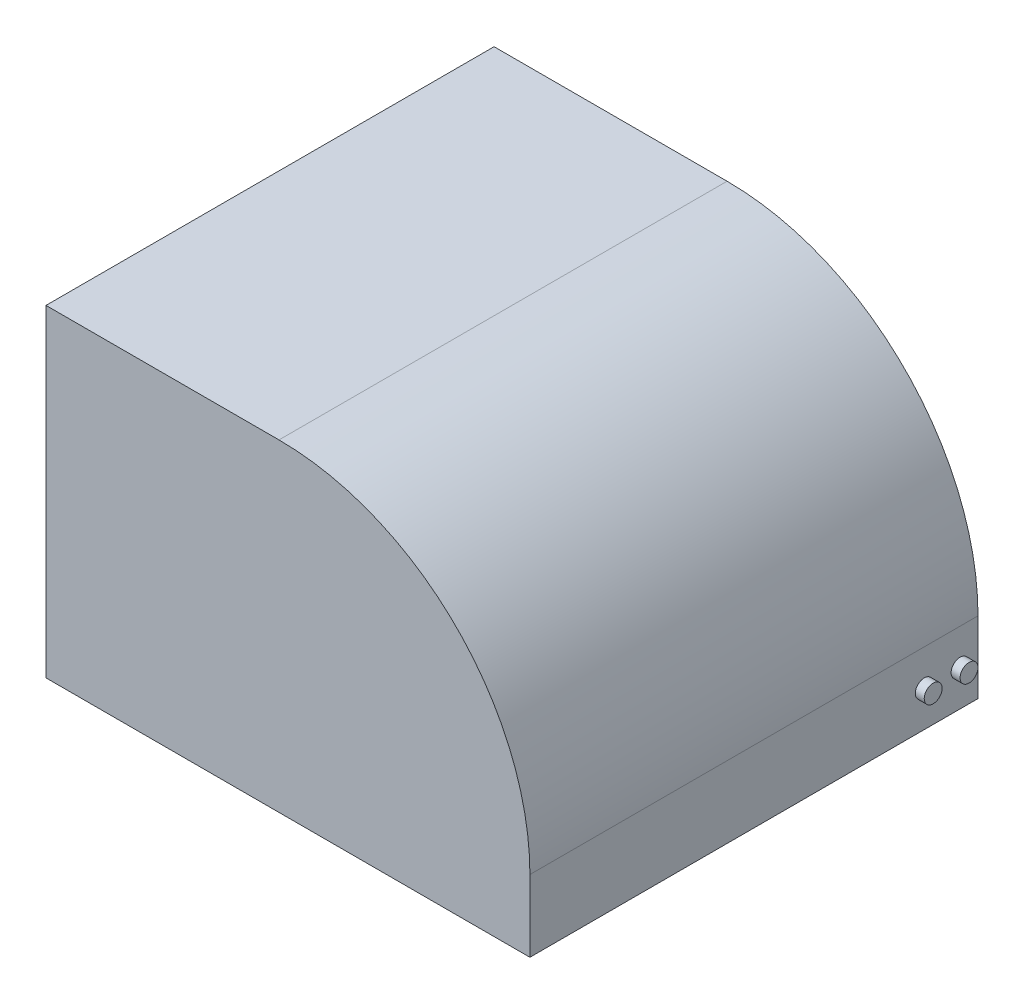
ISO-10303-21;
HEADER;
FILE_DESCRIPTION(('STEP AP214'),'2;1');
FILE_NAME('part.step','',(''),(''),'','','');
FILE_SCHEMA(('AUTOMOTIVE_DESIGN { 1 0 10303 214 1 1 1 1 }'));
ENDSEC;
DATA;
#1=APPLICATION_CONTEXT('core data for automotive mechanical design processes');
#2=APPLICATION_PROTOCOL_DEFINITION('international standard','automotive_design',2000,#1);
#3=PRODUCT_CONTEXT('',#1,'mechanical');
#4=PRODUCT('Part','Part','',(#3));
#5=PRODUCT_RELATED_PRODUCT_CATEGORY('part','',(#4));
#6=PRODUCT_DEFINITION_FORMATION('','',#4);
#7=PRODUCT_DEFINITION_CONTEXT('part definition',#1,'design');
#8=PRODUCT_DEFINITION('design','',#6,#7);
#9=PRODUCT_DEFINITION_SHAPE('','',#8);
#10=(LENGTH_UNIT() NAMED_UNIT(*) SI_UNIT(.MILLI.,.METRE.));
#11=(NAMED_UNIT(*) PLANE_ANGLE_UNIT() SI_UNIT($,.RADIAN.));
#12=(NAMED_UNIT(*) SI_UNIT($,.STERADIAN.) SOLID_ANGLE_UNIT());
#13=UNCERTAINTY_MEASURE_WITH_UNIT(LENGTH_MEASURE(1.E-05),#10,'distance_accuracy_value','');
#14=(GEOMETRIC_REPRESENTATION_CONTEXT(3) GLOBAL_UNCERTAINTY_ASSIGNED_CONTEXT((#13)) GLOBAL_UNIT_ASSIGNED_CONTEXT((#10,
#11,#12)) REPRESENTATION_CONTEXT('',''));
#15=CARTESIAN_POINT('',(0.,0.,0.));
#16=DIRECTION('',(0.,0.,1.));
#17=DIRECTION('',(1.,0.,0.));
#18=AXIS2_PLACEMENT_3D('',#15,#16,#17);
#19=CARTESIAN_POINT('',(-31.75,56.,0.));
#20=DIRECTION('',(0.,0.,1.));
#21=DIRECTION('',(1.,0.,0.));
#22=AXIS2_PLACEMENT_3D('',#19,#20,#21);
#23=CYLINDRICAL_SURFACE('',#22,14.);
#24=DIRECTION('',(0.,0.,-1.));
#25=VECTOR('',#24,1.);
#26=CARTESIAN_POINT('',(-31.75,70.,0.));
#27=LINE('',#26,#25);
#28=CARTESIAN_POINT('',(-31.75,70.,59.));
#29=VERTEX_POINT('',#28);
#30=CARTESIAN_POINT('',(-31.75,70.,34.));
#31=VERTEX_POINT('',#30);
#32=EDGE_CURVE('E106',#29,#31,#27,.T.);
#33=ORIENTED_EDGE('',*,*,#32,.F.);
#34=CARTESIAN_POINT('',(-31.75,56.,59.));
#35=DIRECTION('',(0.,0.,-1.));
#36=DIRECTION('',(-1.,0.,0.));
#37=AXIS2_PLACEMENT_3D('',#34,#35,#36);
#38=CIRCLE('',#37,14.);
#39=CARTESIAN_POINT('',(-17.75,56.,59.));
#40=VERTEX_POINT('',#39);
#41=EDGE_CURVE('E59',#40,#29,#38,.F.);
#42=ORIENTED_EDGE('',*,*,#41,.F.);
#43=DIRECTION('',(0.,0.,-1.));
#44=VECTOR('',#43,1.);
#45=CARTESIAN_POINT('',(-17.75,56.,0.));
#46=LINE('',#45,#44);
#47=CARTESIAN_POINT('',(-17.75,56.,34.));
#48=VERTEX_POINT('',#47);
#49=EDGE_CURVE('E108',#48,#40,#46,.F.);
#50=ORIENTED_EDGE('',*,*,#49,.F.);
#51=CARTESIAN_POINT('',(-31.75,56.,34.));
#52=DIRECTION('',(0.,0.,1.));
#53=DIRECTION('',(1.,0.,0.));
#54=AXIS2_PLACEMENT_3D('',#51,#52,#53);
#55=CIRCLE('',#54,14.);
#56=EDGE_CURVE('E52',#31,#48,#55,.F.);
#57=ORIENTED_EDGE('',*,*,#56,.F.);
#58=EDGE_LOOP('',(#33,#42,#50,#57));
#59=FACE_BOUND('',#58,.T.);
#60=ADVANCED_FACE('F38',(#59),#23,.T.);
#61=CARTESIAN_POINT('',(-17.75,106.796738985948,34.));
#62=DIRECTION('',(-1.,0.,0.));
#63=DIRECTION('',(0.,0.,1.));
#64=AXIS2_PLACEMENT_3D('',#61,#62,#63);
#65=PLANE('',#64);
#66=CARTESIAN_POINT('',(-17.75,54.,37.));
#67=DIRECTION('',(-1.,0.,0.));
#68=DIRECTION('',(0.,0.,1.));
#69=AXIS2_PLACEMENT_3D('',#66,#67,#68);
#70=CIRCLE('',#69,0.499999999999999);
#71=CARTESIAN_POINT('',(-17.75,54.,37.5));
#72=VERTEX_POINT('',#71);
#73=EDGE_CURVE('E11',#72,#72,#70,.F.);
#74=ORIENTED_EDGE('',*,*,#73,.F.);
#75=EDGE_LOOP('',(#74));
#76=FACE_BOUND('',#75,.T.);
#77=CARTESIAN_POINT('',(-17.75,54.,35.));
#78=DIRECTION('',(-1.,0.,0.));
#79=DIRECTION('',(0.,0.,1.));
#80=AXIS2_PLACEMENT_3D('',#77,#78,#79);
#81=CIRCLE('',#80,0.499999999999999);
#82=CARTESIAN_POINT('',(-17.75,54.,35.5));
#83=VERTEX_POINT('',#82);
#84=EDGE_CURVE('E45',#83,#83,#81,.F.);
#85=ORIENTED_EDGE('',*,*,#84,.F.);
#86=EDGE_LOOP('',(#85));
#87=FACE_BOUND('',#86,.T.);
#88=DIRECTION('',(0.,-1.,0.));
#89=VECTOR('',#88,1.);
#90=CARTESIAN_POINT('',(-17.75,106.796738985948,34.));
#91=LINE('',#90,#89);
#92=CARTESIAN_POINT('',(-17.75,52.,34.));
#93=VERTEX_POINT('',#92);
#94=EDGE_CURVE('E115',#48,#93,#91,.T.);
#95=ORIENTED_EDGE('',*,*,#94,.F.);
#96=ORIENTED_EDGE('',*,*,#49,.T.);
#97=DIRECTION('',(0.,-1.,0.));
#98=VECTOR('',#97,1.);
#99=CARTESIAN_POINT('',(-17.75,106.796738985948,59.));
#100=LINE('',#99,#98);
#101=CARTESIAN_POINT('',(-17.75,52.,59.));
#102=VERTEX_POINT('',#101);
#103=EDGE_CURVE('E120',#40,#102,#100,.T.);
#104=ORIENTED_EDGE('',*,*,#103,.T.);
#105=DIRECTION('',(0.,0.,-1.));
#106=VECTOR('',#105,1.);
#107=CARTESIAN_POINT('',(-17.75,52.,34.));
#108=LINE('',#107,#106);
#109=EDGE_CURVE('E112',#102,#93,#108,.T.);
#110=ORIENTED_EDGE('',*,*,#109,.T.);
#111=EDGE_LOOP('',(#95,#96,#104,#110));
#112=FACE_BOUND('',#111,.T.);
#113=ADVANCED_FACE('F130',(#76,#87,#112),#65,.F.);
#114=CARTESIAN_POINT('',(-17.75,106.796738985948,34.));
#115=DIRECTION('',(0.,0.,1.));
#116=DIRECTION('',(1.,0.,0.));
#117=AXIS2_PLACEMENT_3D('',#114,#115,#116);
#118=PLANE('',#117);
#119=DIRECTION('',(-1.,0.,0.));
#120=VECTOR('',#119,1.);
#121=CARTESIAN_POINT('',(-17.75,70.,34.));
#122=LINE('',#121,#120);
#123=CARTESIAN_POINT('',(-44.75,70.,34.));
#124=VERTEX_POINT('',#123);
#125=EDGE_CURVE('E103',#31,#124,#122,.T.);
#126=ORIENTED_EDGE('',*,*,#125,.F.);
#127=ORIENTED_EDGE('',*,*,#56,.T.);
#128=ORIENTED_EDGE('',*,*,#94,.T.);
#129=DIRECTION('',(-1.,0.,0.));
#130=VECTOR('',#129,1.);
#131=CARTESIAN_POINT('',(-17.75,52.,34.));
#132=LINE('',#131,#130);
#133=CARTESIAN_POINT('',(-44.75,52.,34.));
#134=VERTEX_POINT('',#133);
#135=EDGE_CURVE('E117',#93,#134,#132,.T.);
#136=ORIENTED_EDGE('',*,*,#135,.T.);
#137=DIRECTION('',(0.,-1.,0.));
#138=VECTOR('',#137,1.);
#139=CARTESIAN_POINT('',(-44.75,106.796738985948,34.));
#140=LINE('',#139,#138);
#141=EDGE_CURVE('E118',#124,#134,#140,.T.);
#142=ORIENTED_EDGE('',*,*,#141,.F.);
#143=EDGE_LOOP('',(#126,#127,#128,#136,#142));
#144=FACE_BOUND('',#143,.T.);
#145=ADVANCED_FACE('F133',(#144),#118,.F.);
#146=CARTESIAN_POINT('',(-44.75,106.796738985948,34.));
#147=DIRECTION('',(1.,0.,0.));
#148=DIRECTION('',(0.,0.,-1.));
#149=AXIS2_PLACEMENT_3D('',#146,#147,#148);
#150=PLANE('',#149);
#151=DIRECTION('',(0.,0.,1.));
#152=VECTOR('',#151,1.);
#153=CARTESIAN_POINT('',(-44.75,70.,34.));
#154=LINE('',#153,#152);
#155=CARTESIAN_POINT('',(-44.75,70.,59.));
#156=VERTEX_POINT('',#155);
#157=EDGE_CURVE('E88',#124,#156,#154,.T.);
#158=ORIENTED_EDGE('',*,*,#157,.F.);
#159=ORIENTED_EDGE('',*,*,#141,.T.);
#160=DIRECTION('',(0.,0.,1.));
#161=VECTOR('',#160,1.);
#162=CARTESIAN_POINT('',(-44.75,52.,34.));
#163=LINE('',#162,#161);
#164=CARTESIAN_POINT('',(-44.75,52.,59.));
#165=VERTEX_POINT('',#164);
#166=EDGE_CURVE('E91',#134,#165,#163,.T.);
#167=ORIENTED_EDGE('',*,*,#166,.T.);
#168=DIRECTION('',(0.,-1.,0.));
#169=VECTOR('',#168,1.);
#170=CARTESIAN_POINT('',(-44.75,106.796738985948,59.));
#171=LINE('',#170,#169);
#172=EDGE_CURVE('E84',#156,#165,#171,.T.);
#173=ORIENTED_EDGE('',*,*,#172,.F.);
#174=EDGE_LOOP('',(#158,#159,#167,#173));
#175=FACE_BOUND('',#174,.T.);
#176=ADVANCED_FACE('F86',(#175),#150,.F.);
#177=CARTESIAN_POINT('',(-17.75,106.796738985948,59.));
#178=DIRECTION('',(0.,0.,-1.));
#179=DIRECTION('',(-1.,0.,0.));
#180=AXIS2_PLACEMENT_3D('',#177,#178,#179);
#181=PLANE('',#180);
#182=ORIENTED_EDGE('',*,*,#103,.F.);
#183=ORIENTED_EDGE('',*,*,#41,.T.);
#184=DIRECTION('',(1.,0.,0.));
#185=VECTOR('',#184,1.);
#186=CARTESIAN_POINT('',(-17.75,70.,59.));
#187=LINE('',#186,#185);
#188=EDGE_CURVE('E98',#156,#29,#187,.T.);
#189=ORIENTED_EDGE('',*,*,#188,.F.);
#190=ORIENTED_EDGE('',*,*,#172,.T.);
#191=DIRECTION('',(1.,0.,0.));
#192=VECTOR('',#191,1.);
#193=CARTESIAN_POINT('',(-17.75,52.,59.));
#194=LINE('',#193,#192);
#195=EDGE_CURVE('E95',#165,#102,#194,.T.);
#196=ORIENTED_EDGE('',*,*,#195,.T.);
#197=EDGE_LOOP('',(#182,#183,#189,#190,#196));
#198=FACE_BOUND('',#197,.T.);
#199=ADVANCED_FACE('F100',(#198),#181,.F.);
#200=CARTESIAN_POINT('',(0.,52.,0.));
#201=DIRECTION('',(0.,-1.,0.));
#202=DIRECTION('',(0.,0.,-1.));
#203=AXIS2_PLACEMENT_3D('',#200,#201,#202);
#204=PLANE('',#203);
#205=ORIENTED_EDGE('',*,*,#109,.F.);
#206=ORIENTED_EDGE('',*,*,#195,.F.);
#207=ORIENTED_EDGE('',*,*,#166,.F.);
#208=ORIENTED_EDGE('',*,*,#135,.F.);
#209=EDGE_LOOP('',(#205,#206,#207,#208));
#210=FACE_BOUND('',#209,.T.);
#211=ADVANCED_FACE('F142',(#210),#204,.T.);
#212=CARTESIAN_POINT('',(0.,70.,0.));
#213=DIRECTION('',(0.,1.,0.));
#214=DIRECTION('',(0.,0.,1.));
#215=AXIS2_PLACEMENT_3D('',#212,#213,#214);
#216=PLANE('',#215);
#217=ORIENTED_EDGE('',*,*,#188,.T.);
#218=ORIENTED_EDGE('',*,*,#32,.T.);
#219=ORIENTED_EDGE('',*,*,#125,.T.);
#220=ORIENTED_EDGE('',*,*,#157,.T.);
#221=EDGE_LOOP('',(#217,#218,#219,#220));
#222=FACE_BOUND('',#221,.T.);
#223=ADVANCED_FACE('F105',(#222),#216,.T.);
#224=CARTESIAN_POINT('',(-17.25,54.,35.));
#225=DIRECTION('',(-1.,0.,0.));
#226=DIRECTION('',(0.,0.,1.));
#227=AXIS2_PLACEMENT_3D('',#224,#225,#226);
#228=CYLINDRICAL_SURFACE('',#227,0.499999999999999);
#229=CARTESIAN_POINT('',(-17.25,54.,35.));
#230=DIRECTION('',(1.,0.,0.));
#231=DIRECTION('',(0.,0.,-1.));
#232=AXIS2_PLACEMENT_3D('',#229,#230,#231);
#233=CIRCLE('',#232,0.499999999999999);
#234=CARTESIAN_POINT('',(-17.25,54.,34.5));
#235=VERTEX_POINT('',#234);
#236=EDGE_CURVE('E121',#235,#235,#233,.T.);
#237=ORIENTED_EDGE('',*,*,#236,.F.);
#238=EDGE_LOOP('',(#237));
#239=FACE_BOUND('',#238,.T.);
#240=ORIENTED_EDGE('',*,*,#84,.T.);
#241=EDGE_LOOP('',(#240));
#242=FACE_BOUND('',#241,.T.);
#243=ADVANCED_FACE('F128',(#239,#242),#228,.T.);
#244=CARTESIAN_POINT('',(-17.25,54.,35.));
#245=DIRECTION('',(1.,0.,0.));
#246=DIRECTION('',(0.,0.,-1.));
#247=AXIS2_PLACEMENT_3D('',#244,#245,#246);
#248=PLANE('',#247);
#249=ORIENTED_EDGE('',*,*,#236,.T.);
#250=EDGE_LOOP('',(#249));
#251=FACE_BOUND('',#250,.T.);
#252=ADVANCED_FACE('F157',(#251),#248,.T.);
#253=CARTESIAN_POINT('',(-17.25,54.,37.));
#254=DIRECTION('',(-1.,0.,0.));
#255=DIRECTION('',(0.,0.,1.));
#256=AXIS2_PLACEMENT_3D('',#253,#254,#255);
#257=CYLINDRICAL_SURFACE('',#256,0.499999999999999);
#258=CARTESIAN_POINT('',(-17.25,54.,37.));
#259=DIRECTION('',(1.,0.,0.));
#260=DIRECTION('',(0.,0.,-1.));
#261=AXIS2_PLACEMENT_3D('',#258,#259,#260);
#262=CIRCLE('',#261,0.499999999999999);
#263=CARTESIAN_POINT('',(-17.25,54.,36.5));
#264=VERTEX_POINT('',#263);
#265=EDGE_CURVE('E148',#264,#264,#262,.T.);
#266=ORIENTED_EDGE('',*,*,#265,.F.);
#267=EDGE_LOOP('',(#266));
#268=FACE_BOUND('',#267,.T.);
#269=ORIENTED_EDGE('',*,*,#73,.T.);
#270=EDGE_LOOP('',(#269));
#271=FACE_BOUND('',#270,.T.);
#272=ADVANCED_FACE('F154',(#268,#271),#257,.T.);
#273=CARTESIAN_POINT('',(-17.25,54.,37.));
#274=DIRECTION('',(1.,0.,0.));
#275=DIRECTION('',(0.,0.,-1.));
#276=AXIS2_PLACEMENT_3D('',#273,#274,#275);
#277=PLANE('',#276);
#278=ORIENTED_EDGE('',*,*,#265,.T.);
#279=EDGE_LOOP('',(#278));
#280=FACE_BOUND('',#279,.T.);
#281=ADVANCED_FACE('F152',(#280),#277,.T.);
#282=CLOSED_SHELL('',(#60,#113,#145,#176,#199,#211,#223,#243,#252,#272,#281));
#283=MANIFOLD_SOLID_BREP('B2',#282);
#284=ADVANCED_BREP_SHAPE_REPRESENTATION('',(#18,#283),#14);
#285=SHAPE_DEFINITION_REPRESENTATION(#9,#284);
ENDSEC;
END-ISO-10303-21;
